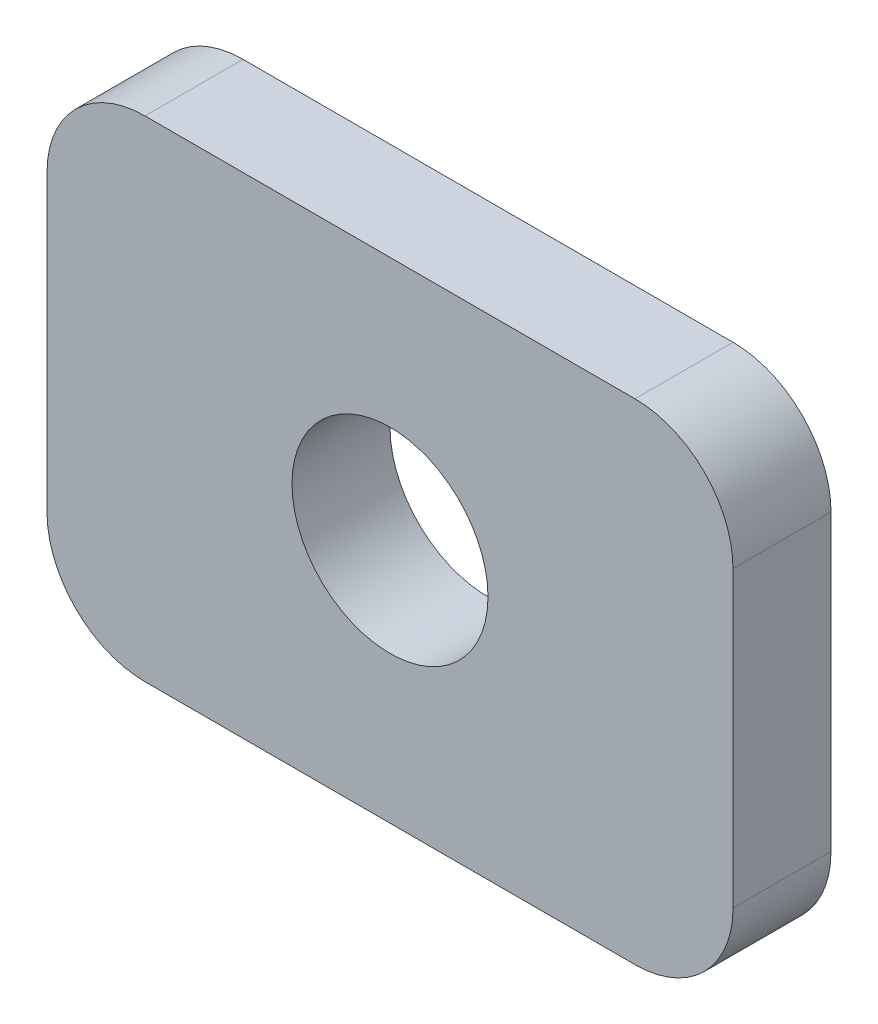
ISO-10303-21;
HEADER;
FILE_DESCRIPTION(('STEP AP214'),'2;1');
FILE_NAME('part.step','',(''),(''),'','','');
FILE_SCHEMA(('AUTOMOTIVE_DESIGN { 1 0 10303 214 1 1 1 1 }'));
ENDSEC;
DATA;
#1=APPLICATION_CONTEXT('core data for automotive mechanical design processes');
#2=APPLICATION_PROTOCOL_DEFINITION('international standard','automotive_design',2000,#1);
#3=PRODUCT_CONTEXT('',#1,'mechanical');
#4=PRODUCT('Part','Part','',(#3));
#5=PRODUCT_RELATED_PRODUCT_CATEGORY('part','',(#4));
#6=PRODUCT_DEFINITION_FORMATION('','',#4);
#7=PRODUCT_DEFINITION_CONTEXT('part definition',#1,'design');
#8=PRODUCT_DEFINITION('design','',#6,#7);
#9=PRODUCT_DEFINITION_SHAPE('','',#8);
#10=(LENGTH_UNIT() NAMED_UNIT(*) SI_UNIT(.MILLI.,.METRE.));
#11=(NAMED_UNIT(*) PLANE_ANGLE_UNIT() SI_UNIT($,.RADIAN.));
#12=(NAMED_UNIT(*) SI_UNIT($,.STERADIAN.) SOLID_ANGLE_UNIT());
#13=UNCERTAINTY_MEASURE_WITH_UNIT(LENGTH_MEASURE(1.E-05),#10,'distance_accuracy_value','');
#14=(GEOMETRIC_REPRESENTATION_CONTEXT(3) GLOBAL_UNCERTAINTY_ASSIGNED_CONTEXT((#13)) GLOBAL_UNIT_ASSIGNED_CONTEXT((#10,
#11,#12)) REPRESENTATION_CONTEXT('',''));
#15=CARTESIAN_POINT('',(0.,0.,0.));
#16=DIRECTION('',(0.,0.,1.));
#17=DIRECTION('',(1.,0.,0.));
#18=AXIS2_PLACEMENT_3D('',#15,#16,#17);
#19=CARTESIAN_POINT('',(10.,10.,10.));
#20=DIRECTION('',(0.,0.,-1.));
#21=DIRECTION('',(-1.,0.,0.));
#22=AXIS2_PLACEMENT_3D('',#19,#20,#21);
#23=PLANE('',#22);
#24=CARTESIAN_POINT('',(10.,10.,10.));
#25=DIRECTION('',(0.,0.,1.));
#26=DIRECTION('',(-1.,0.,0.));
#27=AXIS2_PLACEMENT_3D('',#24,#25,#26);
#28=CIRCLE('',#27,10.);
#29=CARTESIAN_POINT('',(0.,10.0000000000001,10.));
#30=VERTEX_POINT('',#29);
#31=CARTESIAN_POINT('',(10.0000000000001,0.,10.));
#32=VERTEX_POINT('',#31);
#33=EDGE_CURVE('E170',#30,#32,#28,.T.);
#34=ORIENTED_EDGE('',*,*,#33,.T.);
#35=DIRECTION('',(1.,0.,0.));
#36=VECTOR('',#35,1.);
#37=CARTESIAN_POINT('',(10.0000000000001,0.,10.));
#38=LINE('',#37,#36);
#39=CARTESIAN_POINT('',(59.9999999999999,0.,10.));
#40=VERTEX_POINT('',#39);
#41=EDGE_CURVE('E106',#32,#40,#38,.T.);
#42=ORIENTED_EDGE('',*,*,#41,.T.);
#43=CARTESIAN_POINT('',(60.,10.,10.));
#44=DIRECTION('',(0.,0.,1.));
#45=DIRECTION('',(1.,0.,0.));
#46=AXIS2_PLACEMENT_3D('',#43,#44,#45);
#47=CIRCLE('',#46,10.);
#48=CARTESIAN_POINT('',(70.,10.,10.));
#49=VERTEX_POINT('',#48);
#50=EDGE_CURVE('E191',#40,#49,#47,.T.);
#51=ORIENTED_EDGE('',*,*,#50,.T.);
#52=DIRECTION('',(0.,1.,0.));
#53=VECTOR('',#52,1.);
#54=CARTESIAN_POINT('',(70.,10.0000000000001,10.));
#55=LINE('',#54,#53);
#56=CARTESIAN_POINT('',(70.,39.9999999999999,10.));
#57=VERTEX_POINT('',#56);
#58=EDGE_CURVE('E205',#49,#57,#55,.T.);
#59=ORIENTED_EDGE('',*,*,#58,.T.);
#60=CARTESIAN_POINT('',(60.,40.,10.));
#61=DIRECTION('',(0.,0.,1.));
#62=DIRECTION('',(-1.,0.,0.));
#63=AXIS2_PLACEMENT_3D('',#60,#61,#62);
#64=CIRCLE('',#63,9.99999999999999);
#65=CARTESIAN_POINT('',(59.9999999999999,50.,10.));
#66=VERTEX_POINT('',#65);
#67=EDGE_CURVE('E125',#57,#66,#64,.T.);
#68=ORIENTED_EDGE('',*,*,#67,.T.);
#69=DIRECTION('',(-1.,0.,0.));
#70=VECTOR('',#69,1.);
#71=CARTESIAN_POINT('',(10.0000000000001,50.,10.));
#72=LINE('',#71,#70);
#73=CARTESIAN_POINT('',(10.0000000000001,50.,10.));
#74=VERTEX_POINT('',#73);
#75=EDGE_CURVE('E119',#66,#74,#72,.T.);
#76=ORIENTED_EDGE('',*,*,#75,.T.);
#77=CARTESIAN_POINT('',(10.,40.,10.));
#78=DIRECTION('',(0.,0.,1.));
#79=DIRECTION('',(-1.,0.,0.));
#80=AXIS2_PLACEMENT_3D('',#77,#78,#79);
#81=CIRCLE('',#80,10.);
#82=CARTESIAN_POINT('',(0.,39.9999999999999,10.));
#83=VERTEX_POINT('',#82);
#84=EDGE_CURVE('E123',#74,#83,#81,.T.);
#85=ORIENTED_EDGE('',*,*,#84,.T.);
#86=DIRECTION('',(0.,-1.,0.));
#87=VECTOR('',#86,1.);
#88=CARTESIAN_POINT('',(0.,10.0000000000001,10.));
#89=LINE('',#88,#87);
#90=EDGE_CURVE('E63',#83,#30,#89,.T.);
#91=ORIENTED_EDGE('',*,*,#90,.T.);
#92=EDGE_LOOP('',(#34,#42,#51,#59,#68,#76,#85,#91));
#93=FACE_BOUND('',#92,.T.);
#94=CARTESIAN_POINT('',(34.9999999999983,25.0000000000028,10.));
#95=DIRECTION('',(0.,0.,1.));
#96=DIRECTION('',(1.,0.,0.));
#97=AXIS2_PLACEMENT_3D('',#94,#95,#96);
#98=CIRCLE('',#97,10.);
#99=CARTESIAN_POINT('',(44.9999999999983,25.0000000000028,10.));
#100=VERTEX_POINT('',#99);
#101=EDGE_CURVE('E152',#100,#100,#98,.T.);
#102=ORIENTED_EDGE('',*,*,#101,.F.);
#103=EDGE_LOOP('',(#102));
#104=FACE_BOUND('',#103,.T.);
#105=ADVANCED_FACE('F45',(#93,#104),#23,.F.);
#106=CARTESIAN_POINT('',(10.,10.,0.));
#107=DIRECTION('',(0.,0.,-1.));
#108=DIRECTION('',(-1.,0.,0.));
#109=AXIS2_PLACEMENT_3D('',#106,#107,#108);
#110=PLANE('',#109);
#111=CARTESIAN_POINT('',(10.,10.,0.));
#112=DIRECTION('',(0.,0.,1.));
#113=DIRECTION('',(-1.,0.,0.));
#114=AXIS2_PLACEMENT_3D('',#111,#112,#113);
#115=CIRCLE('',#114,10.);
#116=CARTESIAN_POINT('',(0.,10.0000000000001,0.));
#117=VERTEX_POINT('',#116);
#118=CARTESIAN_POINT('',(10.0000000000001,0.,0.));
#119=VERTEX_POINT('',#118);
#120=EDGE_CURVE('E147',#117,#119,#115,.T.);
#121=ORIENTED_EDGE('',*,*,#120,.F.);
#122=DIRECTION('',(0.,-1.,0.));
#123=VECTOR('',#122,1.);
#124=CARTESIAN_POINT('',(0.,10.0000000000001,0.));
#125=LINE('',#124,#123);
#126=CARTESIAN_POINT('',(0.,39.9999999999999,0.));
#127=VERTEX_POINT('',#126);
#128=EDGE_CURVE('E98',#127,#117,#125,.T.);
#129=ORIENTED_EDGE('',*,*,#128,.F.);
#130=CARTESIAN_POINT('',(10.,40.,0.));
#131=DIRECTION('',(0.,0.,1.));
#132=DIRECTION('',(-1.,0.,0.));
#133=AXIS2_PLACEMENT_3D('',#130,#131,#132);
#134=CIRCLE('',#133,10.);
#135=CARTESIAN_POINT('',(10.0000000000001,50.,0.));
#136=VERTEX_POINT('',#135);
#137=EDGE_CURVE('E92',#136,#127,#134,.T.);
#138=ORIENTED_EDGE('',*,*,#137,.F.);
#139=DIRECTION('',(-1.,0.,0.));
#140=VECTOR('',#139,1.);
#141=CARTESIAN_POINT('',(10.0000000000001,50.,0.));
#142=LINE('',#141,#140);
#143=CARTESIAN_POINT('',(59.9999999999999,50.,0.));
#144=VERTEX_POINT('',#143);
#145=EDGE_CURVE('E134',#144,#136,#142,.T.);
#146=ORIENTED_EDGE('',*,*,#145,.F.);
#147=CARTESIAN_POINT('',(60.,40.,0.));
#148=DIRECTION('',(0.,0.,1.));
#149=DIRECTION('',(-1.,0.,0.));
#150=AXIS2_PLACEMENT_3D('',#147,#148,#149);
#151=CIRCLE('',#150,9.99999999999999);
#152=CARTESIAN_POINT('',(70.,39.9999999999999,0.));
#153=VERTEX_POINT('',#152);
#154=EDGE_CURVE('E161',#153,#144,#151,.T.);
#155=ORIENTED_EDGE('',*,*,#154,.F.);
#156=DIRECTION('',(0.,1.,0.));
#157=VECTOR('',#156,1.);
#158=CARTESIAN_POINT('',(70.,10.0000000000001,0.));
#159=LINE('',#158,#157);
#160=CARTESIAN_POINT('',(70.,10.,0.));
#161=VERTEX_POINT('',#160);
#162=EDGE_CURVE('E158',#161,#153,#159,.T.);
#163=ORIENTED_EDGE('',*,*,#162,.F.);
#164=CARTESIAN_POINT('',(60.,10.,0.));
#165=DIRECTION('',(0.,0.,1.));
#166=DIRECTION('',(1.,0.,0.));
#167=AXIS2_PLACEMENT_3D('',#164,#165,#166);
#168=CIRCLE('',#167,10.);
#169=CARTESIAN_POINT('',(59.9999999999999,0.,0.));
#170=VERTEX_POINT('',#169);
#171=EDGE_CURVE('E155',#170,#161,#168,.T.);
#172=ORIENTED_EDGE('',*,*,#171,.F.);
#173=DIRECTION('',(1.,0.,0.));
#174=VECTOR('',#173,1.);
#175=CARTESIAN_POINT('',(10.0000000000001,0.,0.));
#176=LINE('',#175,#174);
#177=EDGE_CURVE('E151',#119,#170,#176,.T.);
#178=ORIENTED_EDGE('',*,*,#177,.F.);
#179=EDGE_LOOP('',(#121,#129,#138,#146,#155,#163,#172,#178));
#180=FACE_BOUND('',#179,.T.);
#181=CARTESIAN_POINT('',(34.9999999999983,25.0000000000028,0.));
#182=DIRECTION('',(0.,0.,1.));
#183=DIRECTION('',(1.,0.,0.));
#184=AXIS2_PLACEMENT_3D('',#181,#182,#183);
#185=CIRCLE('',#184,10.);
#186=CARTESIAN_POINT('',(44.9999999999983,25.0000000000028,0.));
#187=VERTEX_POINT('',#186);
#188=EDGE_CURVE('E215',#187,#187,#185,.T.);
#189=ORIENTED_EDGE('',*,*,#188,.T.);
#190=EDGE_LOOP('',(#189));
#191=FACE_BOUND('',#190,.T.);
#192=ADVANCED_FACE('F195',(#180,#191),#110,.T.);
#193=CARTESIAN_POINT('',(10.,10.,10.));
#194=DIRECTION('',(0.,0.,-1.));
#195=DIRECTION('',(-1.,0.,0.));
#196=AXIS2_PLACEMENT_3D('',#193,#194,#195);
#197=CYLINDRICAL_SURFACE('',#196,10.);
#198=ORIENTED_EDGE('',*,*,#120,.T.);
#199=DIRECTION('',(0.,0.,-1.));
#200=VECTOR('',#199,1.);
#201=CARTESIAN_POINT('',(10.0000000000001,0.,10.));
#202=LINE('',#201,#200);
#203=EDGE_CURVE('E11',#32,#119,#202,.T.);
#204=ORIENTED_EDGE('',*,*,#203,.F.);
#205=ORIENTED_EDGE('',*,*,#33,.F.);
#206=DIRECTION('',(0.,0.,-1.));
#207=VECTOR('',#206,1.);
#208=CARTESIAN_POINT('',(0.,10.0000000000001,10.));
#209=LINE('',#208,#207);
#210=EDGE_CURVE('E143',#30,#117,#209,.T.);
#211=ORIENTED_EDGE('',*,*,#210,.T.);
#212=EDGE_LOOP('',(#198,#204,#205,#211));
#213=FACE_BOUND('',#212,.T.);
#214=ADVANCED_FACE('F47',(#213),#197,.T.);
#215=CARTESIAN_POINT('',(10.0000000000001,0.,10.));
#216=DIRECTION('',(0.,1.,0.));
#217=DIRECTION('',(0.,0.,1.));
#218=AXIS2_PLACEMENT_3D('',#215,#216,#217);
#219=PLANE('',#218);
#220=ORIENTED_EDGE('',*,*,#177,.T.);
#221=DIRECTION('',(0.,0.,-1.));
#222=VECTOR('',#221,1.);
#223=CARTESIAN_POINT('',(59.9999999999999,0.,10.));
#224=LINE('',#223,#222);
#225=EDGE_CURVE('E55',#40,#170,#224,.T.);
#226=ORIENTED_EDGE('',*,*,#225,.F.);
#227=ORIENTED_EDGE('',*,*,#41,.F.);
#228=ORIENTED_EDGE('',*,*,#203,.T.);
#229=EDGE_LOOP('',(#220,#226,#227,#228));
#230=FACE_BOUND('',#229,.T.);
#231=ADVANCED_FACE('F245',(#230),#219,.F.);
#232=CARTESIAN_POINT('',(60.,10.,10.));
#233=DIRECTION('',(0.,0.,-1.));
#234=DIRECTION('',(-1.,0.,0.));
#235=AXIS2_PLACEMENT_3D('',#232,#233,#234);
#236=CYLINDRICAL_SURFACE('',#235,10.);
#237=ORIENTED_EDGE('',*,*,#171,.T.);
#238=DIRECTION('',(0.,0.,-1.));
#239=VECTOR('',#238,1.);
#240=CARTESIAN_POINT('',(70.,10.,10.));
#241=LINE('',#240,#239);
#242=EDGE_CURVE('E181',#49,#161,#241,.T.);
#243=ORIENTED_EDGE('',*,*,#242,.F.);
#244=ORIENTED_EDGE('',*,*,#50,.F.);
#245=ORIENTED_EDGE('',*,*,#225,.T.);
#246=EDGE_LOOP('',(#237,#243,#244,#245));
#247=FACE_BOUND('',#246,.T.);
#248=ADVANCED_FACE('F189',(#247),#236,.T.);
#249=CARTESIAN_POINT('',(70.,10.0000000000001,10.));
#250=DIRECTION('',(-1.,0.,0.));
#251=DIRECTION('',(0.,0.,1.));
#252=AXIS2_PLACEMENT_3D('',#249,#250,#251);
#253=PLANE('',#252);
#254=ORIENTED_EDGE('',*,*,#162,.T.);
#255=DIRECTION('',(0.,0.,-1.));
#256=VECTOR('',#255,1.);
#257=CARTESIAN_POINT('',(70.,39.9999999999999,10.));
#258=LINE('',#257,#256);
#259=EDGE_CURVE('E177',#57,#153,#258,.T.);
#260=ORIENTED_EDGE('',*,*,#259,.F.);
#261=ORIENTED_EDGE('',*,*,#58,.F.);
#262=ORIENTED_EDGE('',*,*,#242,.T.);
#263=EDGE_LOOP('',(#254,#260,#261,#262));
#264=FACE_BOUND('',#263,.T.);
#265=ADVANCED_FACE('F200',(#264),#253,.F.);
#266=CARTESIAN_POINT('',(60.,40.,10.));
#267=DIRECTION('',(0.,0.,-1.));
#268=DIRECTION('',(-1.,0.,0.));
#269=AXIS2_PLACEMENT_3D('',#266,#267,#268);
#270=CYLINDRICAL_SURFACE('',#269,9.99999999999999);
#271=ORIENTED_EDGE('',*,*,#154,.T.);
#272=DIRECTION('',(0.,0.,-1.));
#273=VECTOR('',#272,1.);
#274=CARTESIAN_POINT('',(59.9999999999999,50.,10.));
#275=LINE('',#274,#273);
#276=EDGE_CURVE('E136',#66,#144,#275,.T.);
#277=ORIENTED_EDGE('',*,*,#276,.F.);
#278=ORIENTED_EDGE('',*,*,#67,.F.);
#279=ORIENTED_EDGE('',*,*,#259,.T.);
#280=EDGE_LOOP('',(#271,#277,#278,#279));
#281=FACE_BOUND('',#280,.T.);
#282=ADVANCED_FACE('F203',(#281),#270,.T.);
#283=CARTESIAN_POINT('',(10.0000000000001,50.,10.));
#284=DIRECTION('',(0.,-1.,0.));
#285=DIRECTION('',(0.,0.,-1.));
#286=AXIS2_PLACEMENT_3D('',#283,#284,#285);
#287=PLANE('',#286);
#288=ORIENTED_EDGE('',*,*,#145,.T.);
#289=DIRECTION('',(0.,0.,-1.));
#290=VECTOR('',#289,1.);
#291=CARTESIAN_POINT('',(10.0000000000001,50.,10.));
#292=LINE('',#291,#290);
#293=EDGE_CURVE('E131',#74,#136,#292,.T.);
#294=ORIENTED_EDGE('',*,*,#293,.F.);
#295=ORIENTED_EDGE('',*,*,#75,.F.);
#296=ORIENTED_EDGE('',*,*,#276,.T.);
#297=EDGE_LOOP('',(#288,#294,#295,#296));
#298=FACE_BOUND('',#297,.T.);
#299=ADVANCED_FACE('F132',(#298),#287,.F.);
#300=CARTESIAN_POINT('',(10.,40.,10.));
#301=DIRECTION('',(0.,0.,-1.));
#302=DIRECTION('',(-1.,0.,0.));
#303=AXIS2_PLACEMENT_3D('',#300,#301,#302);
#304=CYLINDRICAL_SURFACE('',#303,10.);
#305=ORIENTED_EDGE('',*,*,#137,.T.);
#306=DIRECTION('',(0.,0.,-1.));
#307=VECTOR('',#306,1.);
#308=CARTESIAN_POINT('',(0.,39.9999999999999,10.));
#309=LINE('',#308,#307);
#310=EDGE_CURVE('E137',#83,#127,#309,.T.);
#311=ORIENTED_EDGE('',*,*,#310,.F.);
#312=ORIENTED_EDGE('',*,*,#84,.F.);
#313=ORIENTED_EDGE('',*,*,#293,.T.);
#314=EDGE_LOOP('',(#305,#311,#312,#313));
#315=FACE_BOUND('',#314,.T.);
#316=ADVANCED_FACE('F139',(#315),#304,.T.);
#317=CARTESIAN_POINT('',(0.,10.0000000000001,10.));
#318=DIRECTION('',(1.,0.,0.));
#319=DIRECTION('',(0.,0.,-1.));
#320=AXIS2_PLACEMENT_3D('',#317,#318,#319);
#321=PLANE('',#320);
#322=ORIENTED_EDGE('',*,*,#128,.T.);
#323=ORIENTED_EDGE('',*,*,#210,.F.);
#324=ORIENTED_EDGE('',*,*,#90,.F.);
#325=ORIENTED_EDGE('',*,*,#310,.T.);
#326=EDGE_LOOP('',(#322,#323,#324,#325));
#327=FACE_BOUND('',#326,.T.);
#328=ADVANCED_FACE('F233',(#327),#321,.F.);
#329=CARTESIAN_POINT('',(34.9999999999983,25.0000000000028,10.));
#330=DIRECTION('',(0.,0.,-1.));
#331=DIRECTION('',(-1.,0.,0.));
#332=AXIS2_PLACEMENT_3D('',#329,#330,#331);
#333=CYLINDRICAL_SURFACE('',#332,10.);
#334=ORIENTED_EDGE('',*,*,#101,.T.);
#335=EDGE_LOOP('',(#334));
#336=FACE_BOUND('',#335,.T.);
#337=ORIENTED_EDGE('',*,*,#188,.F.);
#338=EDGE_LOOP('',(#337));
#339=FACE_BOUND('',#338,.T.);
#340=ADVANCED_FACE('F223',(#336,#339),#333,.F.);
#341=CLOSED_SHELL('',(#105,#192,#214,#231,#248,#265,#282,#299,#316,#328,#340));
#342=MANIFOLD_SOLID_BREP('B2',#341);
#343=ADVANCED_BREP_SHAPE_REPRESENTATION('',(#18,#342),#14);
#344=SHAPE_DEFINITION_REPRESENTATION(#9,#343);
ENDSEC;
END-ISO-10303-21;
